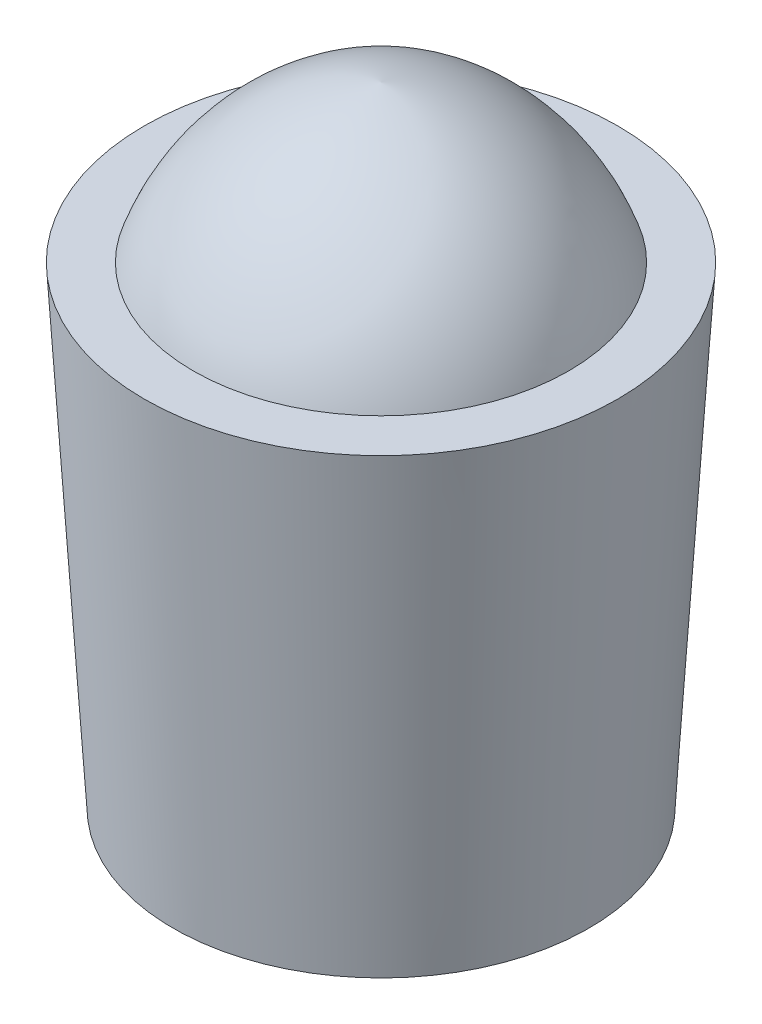
ISO-10303-21;
HEADER;
FILE_DESCRIPTION(('STEP AP214'),'2;1');
FILE_NAME('part.step','',(''),(''),'','','');
FILE_SCHEMA(('AUTOMOTIVE_DESIGN { 1 0 10303 214 1 1 1 1 }'));
ENDSEC;
DATA;
#1=APPLICATION_CONTEXT('core data for automotive mechanical design processes');
#2=APPLICATION_PROTOCOL_DEFINITION('international standard','automotive_design',2000,#1);
#3=PRODUCT_CONTEXT('',#1,'mechanical');
#4=PRODUCT('Part','Part','',(#3));
#5=PRODUCT_RELATED_PRODUCT_CATEGORY('part','',(#4));
#6=PRODUCT_DEFINITION_FORMATION('','',#4);
#7=PRODUCT_DEFINITION_CONTEXT('part definition',#1,'design');
#8=PRODUCT_DEFINITION('design','',#6,#7);
#9=PRODUCT_DEFINITION_SHAPE('','',#8);
#10=(LENGTH_UNIT() NAMED_UNIT(*) SI_UNIT(.MILLI.,.METRE.));
#11=(NAMED_UNIT(*) PLANE_ANGLE_UNIT() SI_UNIT($,.RADIAN.));
#12=(NAMED_UNIT(*) SI_UNIT($,.STERADIAN.) SOLID_ANGLE_UNIT());
#13=UNCERTAINTY_MEASURE_WITH_UNIT(LENGTH_MEASURE(1.E-05),#10,'distance_accuracy_value','');
#14=(GEOMETRIC_REPRESENTATION_CONTEXT(3) GLOBAL_UNCERTAINTY_ASSIGNED_CONTEXT((#13)) GLOBAL_UNIT_ASSIGNED_CONTEXT((#10,
#11,#12)) REPRESENTATION_CONTEXT('',''));
#15=CARTESIAN_POINT('',(0.,0.,0.));
#16=DIRECTION('',(0.,0.,1.));
#17=DIRECTION('',(1.,0.,0.));
#18=AXIS2_PLACEMENT_3D('',#15,#16,#17);
#19=CARTESIAN_POINT('',(0.,0.,0.));
#20=DIRECTION('',(0.,-1.,0.));
#21=DIRECTION('',(0.,0.,-1.));
#22=AXIS2_PLACEMENT_3D('',#19,#20,#21);
#23=PLANE('',#22);
#24=CARTESIAN_POINT('',(0.,0.,0.));
#25=DIRECTION('',(0.,-1.,0.));
#26=DIRECTION('',(0.,0.,-1.));
#27=AXIS2_PLACEMENT_3D('',#24,#25,#26);
#28=CIRCLE('',#27,6.35);
#29=CARTESIAN_POINT('',(0.,0.,-6.35));
#30=VERTEX_POINT('',#29);
#31=EDGE_CURVE('E57',#30,#30,#28,.T.);
#32=ORIENTED_EDGE('',*,*,#31,.T.);
#33=EDGE_LOOP('',(#32));
#34=FACE_BOUND('',#33,.T.);
#35=ADVANCED_FACE('F35',(#34),#23,.T.);
#36=CARTESIAN_POINT('',(0.,12.1594348482039,1.00881575294975));
#37=DIRECTION('',(-1.,0.,0.));
#38=DIRECTION('',(0.,0.,-1.));
#39=AXIS2_PLACEMENT_3D('',#36,#37,#38);
#40=CIRCLE('',#39,7.12404311555447);
#41=TRIMMED_CURVE('',#40,(PARAMETER_VALUE(-1.42871154554922)),
(PARAMETER_VALUE(1.42871154554922)),.T.,.PARAMETER.);
#42=CARTESIAN_POINT('',(0.,12.1594348482039,0.));
#43=DIRECTION('',(0.,-1.,0.));
#44=AXIS1_PLACEMENT('',#42,#43);
#45=SURFACE_OF_REVOLUTION('',#41,#44);
#46=CARTESIAN_POINT('',(0.,19.2116884659405,0.));
#47=VERTEX_POINT('',#46);
#48=VERTEX_LOOP('',#47);
#49=FACE_BOUND('',#48,.T.);
#50=CARTESIAN_POINT('',(0.,14.4435849496907,0.));
#51=DIRECTION('',(0.,-1.,0.));
#52=DIRECTION('',(0.,0.,-1.));
#53=AXIS2_PLACEMENT_3D('',#50,#51,#52);
#54=CIRCLE('',#53,5.73912086694797);
#55=CARTESIAN_POINT('',(0.,14.4435849496907,-5.73912086694797));
#56=VERTEX_POINT('',#55);
#57=EDGE_CURVE('E11',#56,#56,#54,.T.);
#58=ORIENTED_EDGE('',*,*,#57,.F.);
#59=EDGE_LOOP('',(#58));
#60=FACE_BOUND('',#59,.T.);
#61=ADVANCED_FACE('F44',(#49,#60),#45,.T.);
#62=CARTESIAN_POINT('',(7.23189794618749,14.4435849496907,0.));
#63=DIRECTION('',(0.,1.,0.));
#64=DIRECTION('',(0.,0.,1.));
#65=AXIS2_PLACEMENT_3D('',#62,#63,#64);
#66=PLANE('',#65);
#67=ORIENTED_EDGE('',*,*,#57,.T.);
#68=EDGE_LOOP('',(#67));
#69=FACE_BOUND('',#68,.T.);
#70=CARTESIAN_POINT('',(0.,14.4435849496907,0.));
#71=DIRECTION('',(0.,-1.,0.));
#72=DIRECTION('',(0.,0.,-1.));
#73=AXIS2_PLACEMENT_3D('',#70,#71,#72);
#74=CIRCLE('',#73,7.23189794618749);
#75=CARTESIAN_POINT('',(0.,14.4435849496907,-7.23189794618749));
#76=VERTEX_POINT('',#75);
#77=EDGE_CURVE('E41',#76,#76,#74,.T.);
#78=ORIENTED_EDGE('',*,*,#77,.F.);
#79=EDGE_LOOP('',(#78));
#80=FACE_BOUND('',#79,.T.);
#81=ADVANCED_FACE('F47',(#69,#80),#66,.T.);
#82=CARTESIAN_POINT('',(0.,0.,0.));
#83=DIRECTION('',(0.,1.,0.));
#84=DIRECTION('',(0.,0.,1.));
#85=AXIS2_PLACEMENT_3D('',#82,#83,#84);
#86=CONICAL_SURFACE('',#85,6.35,0.0609823988891042);
#87=ORIENTED_EDGE('',*,*,#77,.T.);
#88=EDGE_LOOP('',(#87));
#89=FACE_BOUND('',#88,.T.);
#90=ORIENTED_EDGE('',*,*,#31,.F.);
#91=EDGE_LOOP('',(#90));
#92=FACE_BOUND('',#91,.T.);
#93=ADVANCED_FACE('F52',(#89,#92),#86,.T.);
#94=CLOSED_SHELL('',(#35,#61,#81,#93));
#95=MANIFOLD_SOLID_BREP('B2',#94);
#96=ADVANCED_BREP_SHAPE_REPRESENTATION('',(#18,#95),#14);
#97=SHAPE_DEFINITION_REPRESENTATION(#9,#96);
ENDSEC;
END-ISO-10303-21;
